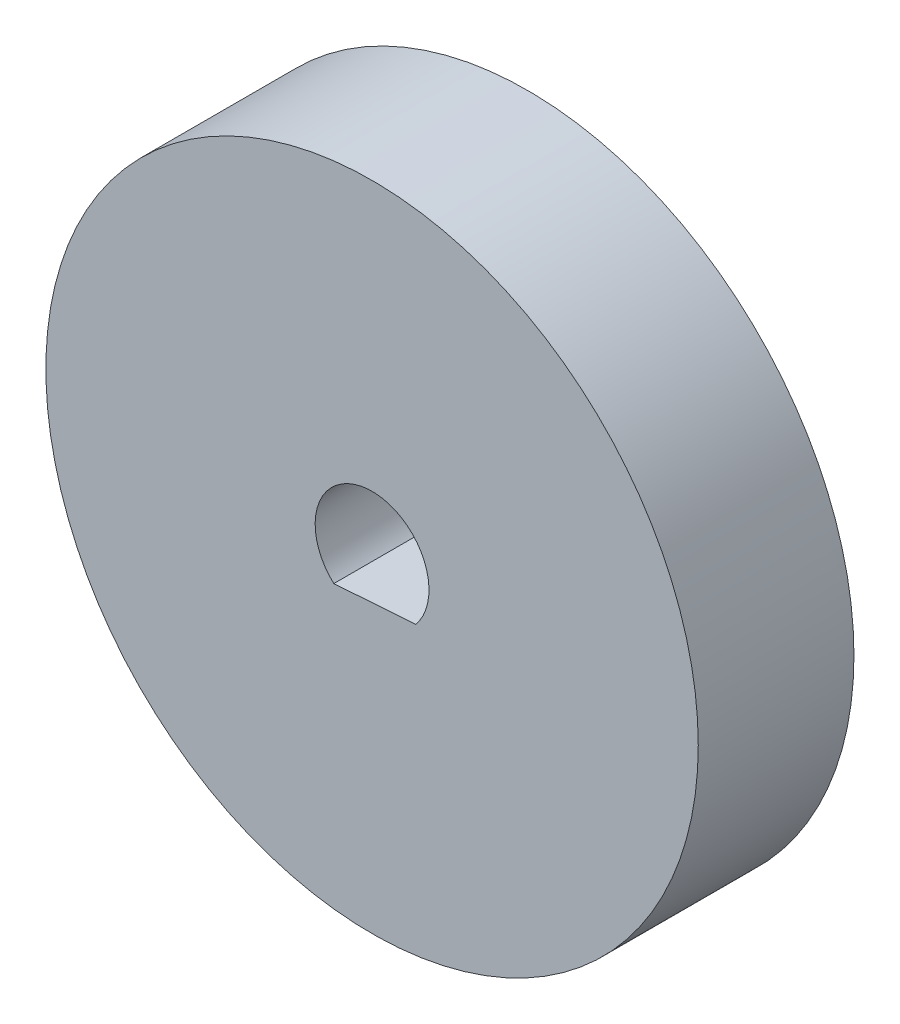
ISO-10303-21;
HEADER;
FILE_DESCRIPTION(('STEP AP214'),'2;1');
FILE_NAME('part.step','',(''),(''),'','','');
FILE_SCHEMA(('AUTOMOTIVE_DESIGN { 1 0 10303 214 1 1 1 1 }'));
ENDSEC;
DATA;
#1=APPLICATION_CONTEXT('core data for automotive mechanical design processes');
#2=APPLICATION_PROTOCOL_DEFINITION('international standard','automotive_design',2000,#1);
#3=PRODUCT_CONTEXT('',#1,'mechanical');
#4=PRODUCT('Part','Part','',(#3));
#5=PRODUCT_RELATED_PRODUCT_CATEGORY('part','',(#4));
#6=PRODUCT_DEFINITION_FORMATION('','',#4);
#7=PRODUCT_DEFINITION_CONTEXT('part definition',#1,'design');
#8=PRODUCT_DEFINITION('design','',#6,#7);
#9=PRODUCT_DEFINITION_SHAPE('','',#8);
#10=(LENGTH_UNIT() NAMED_UNIT(*) SI_UNIT(.MILLI.,.METRE.));
#11=(NAMED_UNIT(*) PLANE_ANGLE_UNIT() SI_UNIT($,.RADIAN.));
#12=(NAMED_UNIT(*) SI_UNIT($,.STERADIAN.) SOLID_ANGLE_UNIT());
#13=UNCERTAINTY_MEASURE_WITH_UNIT(LENGTH_MEASURE(1.E-05),#10,'distance_accuracy_value','');
#14=(GEOMETRIC_REPRESENTATION_CONTEXT(3) GLOBAL_UNCERTAINTY_ASSIGNED_CONTEXT((#13)) GLOBAL_UNIT_ASSIGNED_CONTEXT((#10,
#11,#12)) REPRESENTATION_CONTEXT('',''));
#15=CARTESIAN_POINT('',(0.,0.,0.));
#16=DIRECTION('',(0.,0.,1.));
#17=DIRECTION('',(1.,0.,0.));
#18=AXIS2_PLACEMENT_3D('',#15,#16,#17);
#19=CARTESIAN_POINT('',(0.,7.28960820003668,5.334));
#20=DIRECTION('',(0.,0.,-1.));
#21=DIRECTION('',(-1.,0.,0.));
#22=AXIS2_PLACEMENT_3D('',#19,#20,#21);
#23=CYLINDRICAL_SURFACE('',#22,11.176);
#24=CARTESIAN_POINT('',(0.,7.28960820003668,5.334));
#25=DIRECTION('',(0.,0.,1.));
#26=DIRECTION('',(1.,0.,0.));
#27=AXIS2_PLACEMENT_3D('',#24,#25,#26);
#28=CIRCLE('',#27,11.176);
#29=CARTESIAN_POINT('',(11.176,7.28960820003668,5.334));
#30=VERTEX_POINT('',#29);
#31=EDGE_CURVE('E11',#30,#30,#28,.T.);
#32=ORIENTED_EDGE('',*,*,#31,.F.);
#33=EDGE_LOOP('',(#32));
#34=FACE_BOUND('',#33,.T.);
#35=CARTESIAN_POINT('',(0.,7.28960820003668,0.));
#36=DIRECTION('',(0.,0.,1.));
#37=DIRECTION('',(1.,0.,0.));
#38=AXIS2_PLACEMENT_3D('',#35,#36,#37);
#39=CIRCLE('',#38,11.176);
#40=CARTESIAN_POINT('',(11.176,7.28960820003668,0.));
#41=VERTEX_POINT('',#40);
#42=EDGE_CURVE('E38',#41,#41,#39,.T.);
#43=ORIENTED_EDGE('',*,*,#42,.T.);
#44=EDGE_LOOP('',(#43));
#45=FACE_BOUND('',#44,.T.);
#46=ADVANCED_FACE('F35',(#34,#45),#23,.T.);
#47=CARTESIAN_POINT('',(0.,7.28960820003668,5.334));
#48=DIRECTION('',(0.,0.,1.));
#49=DIRECTION('',(1.,0.,0.));
#50=AXIS2_PLACEMENT_3D('',#47,#48,#49);
#51=PLANE('',#50);
#52=DIRECTION('',(-0.997623607863514,-0.0688994704869773,0.));
#53=VECTOR('',#52,1.);
#54=CARTESIAN_POINT('',(-0.408042316587414,5.90821156037567,5.334));
#55=LINE('',#54,#53);
#56=CARTESIAN_POINT('',(1.4967951329659,6.03976647808562,5.334));
#57=VERTEX_POINT('',#56);
#58=CARTESIAN_POINT('',(-1.31076656265106,5.84586618075625,5.334));
#59=VERTEX_POINT('',#58);
#60=EDGE_CURVE('E49',#57,#59,#55,.T.);
#61=ORIENTED_EDGE('',*,*,#60,.T.);
#62=CARTESIAN_POINT('',(0.,7.28960820003668,5.334));
#63=DIRECTION('',(0.,0.,-1.));
#64=DIRECTION('',(-1.,0.,0.));
#65=AXIS2_PLACEMENT_3D('',#62,#63,#64);
#66=CIRCLE('',#65,1.95);
#67=EDGE_CURVE('E76',#59,#57,#66,.T.);
#68=ORIENTED_EDGE('',*,*,#67,.T.);
#69=EDGE_LOOP('',(#61,#68));
#70=FACE_BOUND('',#69,.T.);
#71=ORIENTED_EDGE('',*,*,#31,.T.);
#72=EDGE_LOOP('',(#71));
#73=FACE_BOUND('',#72,.T.);
#74=ADVANCED_FACE('F80',(#70,#73),#51,.T.);
#75=CARTESIAN_POINT('',(0.,7.28960820003668,0.));
#76=DIRECTION('',(0.,0.,1.));
#77=DIRECTION('',(1.,0.,0.));
#78=AXIS2_PLACEMENT_3D('',#75,#76,#77);
#79=PLANE('',#78);
#80=CARTESIAN_POINT('',(0.,7.28960820003668,0.));
#81=DIRECTION('',(0.,0.,-1.));
#82=DIRECTION('',(-1.,0.,0.));
#83=AXIS2_PLACEMENT_3D('',#80,#81,#82);
#84=CIRCLE('',#83,1.95);
#85=CARTESIAN_POINT('',(-1.31076656265106,5.84586618075625,0.));
#86=VERTEX_POINT('',#85);
#87=CARTESIAN_POINT('',(1.4967951329659,6.03976647808562,0.));
#88=VERTEX_POINT('',#87);
#89=EDGE_CURVE('E68',#86,#88,#84,.T.);
#90=ORIENTED_EDGE('',*,*,#89,.F.);
#91=DIRECTION('',(-0.997623607863514,-0.0688994704869773,0.));
#92=VECTOR('',#91,1.);
#93=CARTESIAN_POINT('',(-0.408042316587414,5.90821156037567,0.));
#94=LINE('',#93,#92);
#95=EDGE_CURVE('E54',#88,#86,#94,.T.);
#96=ORIENTED_EDGE('',*,*,#95,.F.);
#97=EDGE_LOOP('',(#90,#96));
#98=FACE_BOUND('',#97,.T.);
#99=ORIENTED_EDGE('',*,*,#42,.F.);
#100=EDGE_LOOP('',(#99));
#101=FACE_BOUND('',#100,.T.);
#102=ADVANCED_FACE('F72',(#98,#101),#79,.F.);
#103=CARTESIAN_POINT('',(-0.408042316587414,5.90821156037567,5.334));
#104=DIRECTION('',(0.0688994704869773,-0.997623607863514,0.));
#105=DIRECTION('',(0.997623607863514,0.0688994704869773,0.));
#106=AXIS2_PLACEMENT_3D('',#103,#104,#105);
#107=PLANE('',#106);
#108=ORIENTED_EDGE('',*,*,#95,.T.);
#109=DIRECTION('',(0.,0.,-1.));
#110=VECTOR('',#109,1.);
#111=CARTESIAN_POINT('',(-1.31076656265106,5.84586618075625,5.334));
#112=LINE('',#111,#110);
#113=EDGE_CURVE('E65',#59,#86,#112,.T.);
#114=ORIENTED_EDGE('',*,*,#113,.F.);
#115=ORIENTED_EDGE('',*,*,#60,.F.);
#116=DIRECTION('',(0.,0.,-1.));
#117=VECTOR('',#116,1.);
#118=CARTESIAN_POINT('',(1.4967951329659,6.03976647808562,5.334));
#119=LINE('',#118,#117);
#120=EDGE_CURVE('E59',#57,#88,#119,.T.);
#121=ORIENTED_EDGE('',*,*,#120,.T.);
#122=EDGE_LOOP('',(#108,#114,#115,#121));
#123=FACE_BOUND('',#122,.T.);
#124=ADVANCED_FACE('F61',(#123),#107,.F.);
#125=CARTESIAN_POINT('',(0.,7.28960820003668,5.334));
#126=DIRECTION('',(0.,0.,-1.));
#127=DIRECTION('',(-1.,0.,0.));
#128=AXIS2_PLACEMENT_3D('',#125,#126,#127);
#129=CYLINDRICAL_SURFACE('',#128,1.95);
#130=ORIENTED_EDGE('',*,*,#89,.T.);
#131=ORIENTED_EDGE('',*,*,#120,.F.);
#132=ORIENTED_EDGE('',*,*,#67,.F.);
#133=ORIENTED_EDGE('',*,*,#113,.T.);
#134=EDGE_LOOP('',(#130,#131,#132,#133));
#135=FACE_BOUND('',#134,.T.);
#136=ADVANCED_FACE('F69',(#135),#129,.F.);
#137=CLOSED_SHELL('',(#46,#74,#102,#124,#136));
#138=MANIFOLD_SOLID_BREP('B2',#137);
#139=ADVANCED_BREP_SHAPE_REPRESENTATION('',(#18,#138),#14);
#140=SHAPE_DEFINITION_REPRESENTATION(#9,#139);
ENDSEC;
END-ISO-10303-21;
